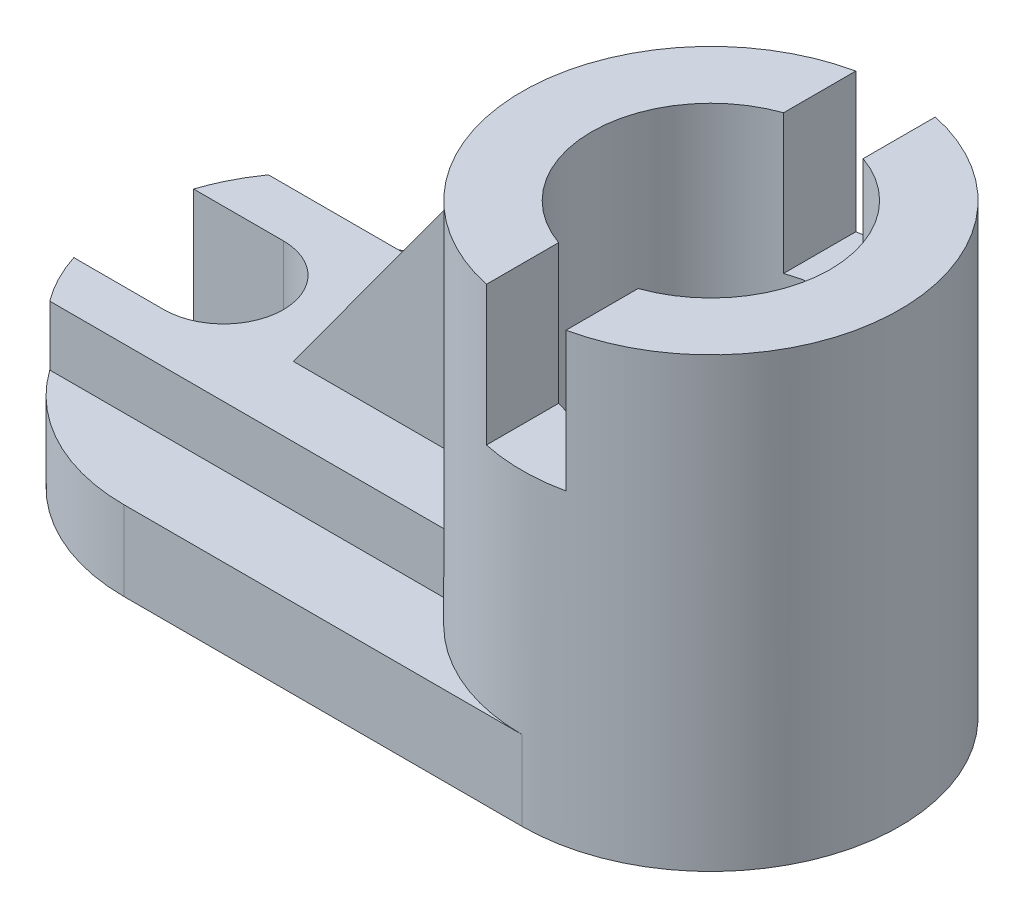
ISO-10303-21;
HEADER;
FILE_DESCRIPTION(('STEP AP214'),'2;1');
FILE_NAME('part.step','',(''),(''),'','','');
FILE_SCHEMA(('AUTOMOTIVE_DESIGN { 1 0 10303 214 1 1 1 1 }'));
ENDSEC;
DATA;
#1=APPLICATION_CONTEXT('core data for automotive mechanical design processes');
#2=APPLICATION_PROTOCOL_DEFINITION('international standard','automotive_design',2000,#1);
#3=PRODUCT_CONTEXT('',#1,'mechanical');
#4=PRODUCT('Part','Part','',(#3));
#5=PRODUCT_RELATED_PRODUCT_CATEGORY('part','',(#4));
#6=PRODUCT_DEFINITION_FORMATION('','',#4);
#7=PRODUCT_DEFINITION_CONTEXT('part definition',#1,'design');
#8=PRODUCT_DEFINITION('design','',#6,#7);
#9=PRODUCT_DEFINITION_SHAPE('','',#8);
#10=(LENGTH_UNIT() NAMED_UNIT(*) SI_UNIT(.MILLI.,.METRE.));
#11=(NAMED_UNIT(*) PLANE_ANGLE_UNIT() SI_UNIT($,.RADIAN.));
#12=(NAMED_UNIT(*) SI_UNIT($,.STERADIAN.) SOLID_ANGLE_UNIT());
#13=UNCERTAINTY_MEASURE_WITH_UNIT(LENGTH_MEASURE(1.E-05),#10,'distance_accuracy_value','');
#14=(GEOMETRIC_REPRESENTATION_CONTEXT(3) GLOBAL_UNCERTAINTY_ASSIGNED_CONTEXT((#13)) GLOBAL_UNIT_ASSIGNED_CONTEXT((#10,
#11,#12)) REPRESENTATION_CONTEXT('',''));
#15=CARTESIAN_POINT('',(0.,0.,0.));
#16=DIRECTION('',(0.,0.,1.));
#17=DIRECTION('',(1.,0.,0.));
#18=AXIS2_PLACEMENT_3D('',#15,#16,#17);
#19=CARTESIAN_POINT('',(0.,45.,0.));
#20=DIRECTION('',(0.,-1.,0.));
#21=DIRECTION('',(0.,0.,-1.));
#22=AXIS2_PLACEMENT_3D('',#19,#20,#21);
#23=CYLINDRICAL_SURFACE('',#22,19.);
#24=CARTESIAN_POINT('',(0.,0.,0.));
#25=DIRECTION('',(0.,1.,0.));
#26=DIRECTION('',(0.,0.,1.));
#27=AXIS2_PLACEMENT_3D('',#24,#25,#26);
#28=CIRCLE('',#27,19.);
#29=CARTESIAN_POINT('',(0.,0.,19.));
#30=VERTEX_POINT('',#29);
#31=CARTESIAN_POINT('',(0.,0.,-19.));
#32=VERTEX_POINT('',#31);
#33=EDGE_CURVE('E477',#30,#32,#28,.T.);
#34=ORIENTED_EDGE('',*,*,#33,.T.);
#35=DIRECTION('',(0.,-1.,0.));
#36=VECTOR('',#35,1.);
#37=CARTESIAN_POINT('',(0.,8.,-19.));
#38=LINE('',#37,#36);
#39=CARTESIAN_POINT('',(0.,8.,-19.));
#40=VERTEX_POINT('',#39);
#41=EDGE_CURVE('E531',#40,#32,#38,.T.);
#42=ORIENTED_EDGE('',*,*,#41,.F.);
#43=CARTESIAN_POINT('',(0.,8.,0.));
#44=DIRECTION('',(0.,1.,0.));
#45=DIRECTION('',(0.,0.,1.));
#46=AXIS2_PLACEMENT_3D('',#43,#44,#45);
#47=CIRCLE('',#46,19.);
#48=CARTESIAN_POINT('',(-15.4919333848297,8.,-11.));
#49=VERTEX_POINT('',#48);
#50=EDGE_CURVE('E436',#40,#49,#47,.T.);
#51=ORIENTED_EDGE('',*,*,#50,.T.);
#52=DIRECTION('',(0.,-1.,0.));
#53=VECTOR('',#52,1.);
#54=CARTESIAN_POINT('',(-15.4919333848297,45.,-11.));
#55=LINE('',#54,#53);
#56=CARTESIAN_POINT('',(-15.4919333848297,14.,-11.));
#57=VERTEX_POINT('',#56);
#58=EDGE_CURVE('E571',#57,#49,#55,.T.);
#59=ORIENTED_EDGE('',*,*,#58,.F.);
#60=CARTESIAN_POINT('',(0.,14.,0.));
#61=DIRECTION('',(0.,-1.,0.));
#62=DIRECTION('',(0.,0.,-1.));
#63=AXIS2_PLACEMENT_3D('',#60,#61,#62);
#64=CIRCLE('',#63,19.);
#65=CARTESIAN_POINT('',(-18.5741756210067,14.,-4.));
#66=VERTEX_POINT('',#65);
#67=EDGE_CURVE('E489',#66,#57,#64,.T.);
#68=ORIENTED_EDGE('',*,*,#67,.F.);
#69=DIRECTION('',(0.,-1.,0.));
#70=VECTOR('',#69,1.);
#71=CARTESIAN_POINT('',(-18.5741756210067,45.,-4.));
#72=LINE('',#71,#70);
#73=CARTESIAN_POINT('',(-18.5741756210067,40.5827070449382,-4.));
#74=VERTEX_POINT('',#73);
#75=EDGE_CURVE('E284',#74,#66,#72,.T.);
#76=ORIENTED_EDGE('',*,*,#75,.F.);
#77=CARTESIAN_POINT('',(0.,66.,0.));
#78=DIRECTION('',(-0.807391122257898,0.59001658934231,0.));
#79=DIRECTION('',(-0.59001658934231,-0.807391122257898,0.));
#80=AXIS2_PLACEMENT_3D('',#77,#78,#79);
#81=ELLIPSE('',#80,32.2024843762092,19.);
#82=CARTESIAN_POINT('',(-18.5741756210067,40.5827070449382,4.));
#83=VERTEX_POINT('',#82);
#84=EDGE_CURVE('E297',#74,#83,#81,.T.);
#85=ORIENTED_EDGE('',*,*,#84,.T.);
#86=DIRECTION('',(0.,-1.,0.));
#87=VECTOR('',#86,1.);
#88=CARTESIAN_POINT('',(-18.5741756210067,45.,4.));
#89=LINE('',#88,#87);
#90=CARTESIAN_POINT('',(-18.5741756210067,14.,4.));
#91=VERTEX_POINT('',#90);
#92=EDGE_CURVE('E291',#83,#91,#89,.T.);
#93=ORIENTED_EDGE('',*,*,#92,.T.);
#94=CARTESIAN_POINT('',(-15.4919333848297,14.,11.));
#95=VERTEX_POINT('',#94);
#96=EDGE_CURVE('E431',#95,#91,#64,.T.);
#97=ORIENTED_EDGE('',*,*,#96,.F.);
#98=DIRECTION('',(0.,-1.,0.));
#99=VECTOR('',#98,1.);
#100=CARTESIAN_POINT('',(-15.4919333848297,45.,11.));
#101=LINE('',#100,#99);
#102=CARTESIAN_POINT('',(-15.4919333848297,8.,11.));
#103=VERTEX_POINT('',#102);
#104=EDGE_CURVE('E574',#103,#95,#101,.F.);
#105=ORIENTED_EDGE('',*,*,#104,.F.);
#106=CARTESIAN_POINT('',(0.,8.,19.));
#107=VERTEX_POINT('',#106);
#108=EDGE_CURVE('E470',#103,#107,#47,.T.);
#109=ORIENTED_EDGE('',*,*,#108,.T.);
#110=DIRECTION('',(0.,-1.,0.));
#111=VECTOR('',#110,1.);
#112=CARTESIAN_POINT('',(0.,8.,19.));
#113=LINE('',#112,#111);
#114=EDGE_CURVE('E534',#107,#30,#113,.T.);
#115=ORIENTED_EDGE('',*,*,#114,.T.);
#116=EDGE_LOOP('',(#34,#42,#51,#59,#68,#76,#85,#93,#97,#105,#109,#115));
#117=FACE_BOUND('',#116,.T.);
#118=CARTESIAN_POINT('',(0.,45.,0.));
#119=DIRECTION('',(0.,1.,0.));
#120=DIRECTION('',(0.,0.,1.));
#121=AXIS2_PLACEMENT_3D('',#118,#119,#120);
#122=CIRCLE('',#121,19.);
#123=CARTESIAN_POINT('',(4.,45.,18.5741756210067));
#124=VERTEX_POINT('',#123);
#125=CARTESIAN_POINT('',(4.,45.,-18.5741756210067));
#126=VERTEX_POINT('',#125);
#127=EDGE_CURVE('E467',#124,#126,#122,.T.);
#128=ORIENTED_EDGE('',*,*,#127,.F.);
#129=DIRECTION('',(0.,-1.,0.));
#130=VECTOR('',#129,1.);
#131=CARTESIAN_POINT('',(4.,45.,18.5741756210067));
#132=LINE('',#131,#130);
#133=CARTESIAN_POINT('',(4.,31.,18.5741756210067));
#134=VERTEX_POINT('',#133);
#135=EDGE_CURVE('E249',#124,#134,#132,.T.);
#136=ORIENTED_EDGE('',*,*,#135,.T.);
#137=CARTESIAN_POINT('',(0.,31.,0.));
#138=DIRECTION('',(0.,-1.,0.));
#139=DIRECTION('',(0.,0.,-1.));
#140=AXIS2_PLACEMENT_3D('',#137,#138,#139);
#141=CIRCLE('',#140,19.);
#142=CARTESIAN_POINT('',(-4.,31.,18.5741756210067));
#143=VERTEX_POINT('',#142);
#144=EDGE_CURVE('E241',#134,#143,#141,.T.);
#145=ORIENTED_EDGE('',*,*,#144,.T.);
#146=DIRECTION('',(0.,-1.,0.));
#147=VECTOR('',#146,1.);
#148=CARTESIAN_POINT('',(-4.,45.,18.5741756210067));
#149=LINE('',#148,#147);
#150=CARTESIAN_POINT('',(-4.,45.,18.5741756210067));
#151=VERTEX_POINT('',#150);
#152=EDGE_CURVE('E256',#151,#143,#149,.T.);
#153=ORIENTED_EDGE('',*,*,#152,.F.);
#154=CARTESIAN_POINT('',(-4.,45.,-18.5741756210067));
#155=VERTEX_POINT('',#154);
#156=EDGE_CURVE('E471',#155,#151,#122,.T.);
#157=ORIENTED_EDGE('',*,*,#156,.F.);
#158=DIRECTION('',(0.,-1.,0.));
#159=VECTOR('',#158,1.);
#160=CARTESIAN_POINT('',(-4.,45.,-18.5741756210067));
#161=LINE('',#160,#159);
#162=CARTESIAN_POINT('',(-4.,31.,-18.5741756210067));
#163=VERTEX_POINT('',#162);
#164=EDGE_CURVE('E239',#163,#155,#161,.F.);
#165=ORIENTED_EDGE('',*,*,#164,.F.);
#166=CARTESIAN_POINT('',(4.,31.,-18.5741756210067));
#167=VERTEX_POINT('',#166);
#168=EDGE_CURVE('E232',#163,#167,#141,.T.);
#169=ORIENTED_EDGE('',*,*,#168,.T.);
#170=DIRECTION('',(0.,-1.,0.));
#171=VECTOR('',#170,1.);
#172=CARTESIAN_POINT('',(4.,45.,-18.5741756210067));
#173=LINE('',#172,#171);
#174=EDGE_CURVE('E217',#167,#126,#173,.F.);
#175=ORIENTED_EDGE('',*,*,#174,.T.);
#176=EDGE_LOOP('',(#128,#136,#145,#153,#157,#165,#169,#175));
#177=FACE_BOUND('',#176,.T.);
#178=ADVANCED_FACE('F39',(#117,#177),#23,.T.);
#179=CARTESIAN_POINT('',(0.,45.,0.));
#180=DIRECTION('',(0.,1.,0.));
#181=DIRECTION('',(0.,0.,1.));
#182=AXIS2_PLACEMENT_3D('',#179,#180,#181);
#183=PLANE('',#182);
#184=ORIENTED_EDGE('',*,*,#156,.T.);
#185=DIRECTION('',(0.,0.,-1.));
#186=VECTOR('',#185,1.);
#187=CARTESIAN_POINT('',(-4.,45.,0.));
#188=LINE('',#187,#186);
#189=CARTESIAN_POINT('',(-4.,45.,11.3137084989848));
#190=VERTEX_POINT('',#189);
#191=EDGE_CURVE('E229',#151,#190,#188,.T.);
#192=ORIENTED_EDGE('',*,*,#191,.T.);
#193=CARTESIAN_POINT('',(0.,45.,0.));
#194=DIRECTION('',(0.,1.,0.));
#195=DIRECTION('',(0.,0.,1.));
#196=AXIS2_PLACEMENT_3D('',#193,#194,#195);
#197=CIRCLE('',#196,12.);
#198=CARTESIAN_POINT('',(-4.,45.,-11.3137084989848));
#199=VERTEX_POINT('',#198);
#200=EDGE_CURVE('E263',#199,#190,#197,.T.);
#201=ORIENTED_EDGE('',*,*,#200,.F.);
#202=EDGE_CURVE('E257',#199,#155,#188,.T.);
#203=ORIENTED_EDGE('',*,*,#202,.T.);
#204=EDGE_LOOP('',(#184,#192,#201,#203));
#205=FACE_BOUND('',#204,.T.);
#206=ADVANCED_FACE('F517',(#205),#183,.T.);
#207=CARTESIAN_POINT('',(0.,0.,0.));
#208=DIRECTION('',(0.,1.,0.));
#209=DIRECTION('',(0.,0.,1.));
#210=AXIS2_PLACEMENT_3D('',#207,#208,#209);
#211=CYLINDRICAL_SURFACE('',#210,12.);
#212=CARTESIAN_POINT('',(0.,0.,0.));
#213=DIRECTION('',(0.,1.,0.));
#214=DIRECTION('',(0.,0.,1.));
#215=AXIS2_PLACEMENT_3D('',#212,#213,#214);
#216=CIRCLE('',#215,12.);
#217=CARTESIAN_POINT('',(0.,0.,12.));
#218=VERTEX_POINT('',#217);
#219=EDGE_CURVE('E264',#218,#218,#216,.T.);
#220=ORIENTED_EDGE('',*,*,#219,.F.);
#221=EDGE_LOOP('',(#220));
#222=FACE_BOUND('',#221,.T.);
#223=DIRECTION('',(0.,1.,0.));
#224=VECTOR('',#223,1.);
#225=CARTESIAN_POINT('',(-4.,0.,11.3137084989848));
#226=LINE('',#225,#224);
#227=CARTESIAN_POINT('',(-4.,31.,11.3137084989848));
#228=VERTEX_POINT('',#227);
#229=EDGE_CURVE('E11',#228,#190,#226,.T.);
#230=ORIENTED_EDGE('',*,*,#229,.F.);
#231=CARTESIAN_POINT('',(0.,31.,0.));
#232=DIRECTION('',(0.,-1.,0.));
#233=DIRECTION('',(0.,0.,-1.));
#234=AXIS2_PLACEMENT_3D('',#231,#232,#233);
#235=CIRCLE('',#234,12.);
#236=CARTESIAN_POINT('',(4.,31.,11.3137084989848));
#237=VERTEX_POINT('',#236);
#238=EDGE_CURVE('E440',#228,#237,#235,.F.);
#239=ORIENTED_EDGE('',*,*,#238,.T.);
#240=DIRECTION('',(0.,1.,0.));
#241=VECTOR('',#240,1.);
#242=CARTESIAN_POINT('',(4.,0.,11.3137084989848));
#243=LINE('',#242,#241);
#244=CARTESIAN_POINT('',(4.,45.,11.3137084989848));
#245=VERTEX_POINT('',#244);
#246=EDGE_CURVE('E47',#237,#245,#243,.T.);
#247=ORIENTED_EDGE('',*,*,#246,.T.);
#248=CARTESIAN_POINT('',(4.,45.,-11.3137084989848));
#249=VERTEX_POINT('',#248);
#250=EDGE_CURVE('E269',#245,#249,#197,.T.);
#251=ORIENTED_EDGE('',*,*,#250,.T.);
#252=DIRECTION('',(0.,1.,0.));
#253=VECTOR('',#252,1.);
#254=CARTESIAN_POINT('',(4.,0.,-11.3137084989848));
#255=LINE('',#254,#253);
#256=CARTESIAN_POINT('',(4.,31.,-11.3137084989848));
#257=VERTEX_POINT('',#256);
#258=EDGE_CURVE('E439',#249,#257,#255,.F.);
#259=ORIENTED_EDGE('',*,*,#258,.T.);
#260=CARTESIAN_POINT('',(-4.,31.,-11.3137084989848));
#261=VERTEX_POINT('',#260);
#262=EDGE_CURVE('E234',#257,#261,#235,.F.);
#263=ORIENTED_EDGE('',*,*,#262,.T.);
#264=DIRECTION('',(0.,1.,0.));
#265=VECTOR('',#264,1.);
#266=CARTESIAN_POINT('',(-4.,0.,-11.3137084989848));
#267=LINE('',#266,#265);
#268=EDGE_CURVE('E443',#199,#261,#267,.F.);
#269=ORIENTED_EDGE('',*,*,#268,.F.);
#270=ORIENTED_EDGE('',*,*,#200,.T.);
#271=EDGE_LOOP('',(#230,#239,#247,#251,#259,#263,#269,#270));
#272=FACE_BOUND('',#271,.T.);
#273=ADVANCED_FACE('F452',(#222,#272),#211,.F.);
#274=CARTESIAN_POINT('',(-40.,8.,0.));
#275=DIRECTION('',(0.,-1.,0.));
#276=DIRECTION('',(0.,0.,-1.));
#277=AXIS2_PLACEMENT_3D('',#274,#275,#276);
#278=CYLINDRICAL_SURFACE('',#277,19.);
#279=CARTESIAN_POINT('',(-40.,8.,0.));
#280=DIRECTION('',(0.,1.,0.));
#281=DIRECTION('',(0.,0.,1.));
#282=AXIS2_PLACEMENT_3D('',#279,#280,#281);
#283=CIRCLE('',#282,19.);
#284=CARTESIAN_POINT('',(-58.0304879395037,8.,5.99178643339468));
#285=VERTEX_POINT('',#284);
#286=CARTESIAN_POINT('',(-55.4919333848297,8.,11.));
#287=VERTEX_POINT('',#286);
#288=EDGE_CURVE('E409',#285,#287,#283,.T.);
#289=ORIENTED_EDGE('',*,*,#288,.F.);
#290=DIRECTION('',(0.,-1.,0.));
#291=VECTOR('',#290,1.);
#292=CARTESIAN_POINT('',(-58.0304879395037,8.,5.99178643339468));
#293=LINE('',#292,#291);
#294=CARTESIAN_POINT('',(-58.0304879395037,0.,5.99178643339469));
#295=VERTEX_POINT('',#294);
#296=EDGE_CURVE('E358',#285,#295,#293,.T.);
#297=ORIENTED_EDGE('',*,*,#296,.T.);
#298=CARTESIAN_POINT('',(-40.,0.,0.));
#299=DIRECTION('',(0.,1.,0.));
#300=DIRECTION('',(0.,0.,1.));
#301=AXIS2_PLACEMENT_3D('',#298,#299,#300);
#302=CIRCLE('',#301,19.);
#303=CARTESIAN_POINT('',(-40.,0.,19.));
#304=VERTEX_POINT('',#303);
#305=EDGE_CURVE('E569',#295,#304,#302,.T.);
#306=ORIENTED_EDGE('',*,*,#305,.T.);
#307=DIRECTION('',(0.,-1.,0.));
#308=VECTOR('',#307,1.);
#309=CARTESIAN_POINT('',(-40.,8.,19.));
#310=LINE('',#309,#308);
#311=CARTESIAN_POINT('',(-40.,8.,19.));
#312=VERTEX_POINT('',#311);
#313=EDGE_CURVE('E480',#312,#304,#310,.T.);
#314=ORIENTED_EDGE('',*,*,#313,.F.);
#315=EDGE_CURVE('E400',#287,#312,#283,.T.);
#316=ORIENTED_EDGE('',*,*,#315,.F.);
#317=EDGE_LOOP('',(#289,#297,#306,#314,#316));
#318=FACE_BOUND('',#317,.T.);
#319=ADVANCED_FACE('F512',(#318),#278,.T.);
#320=CARTESIAN_POINT('',(-55.4919333848297,14.,-11.));
#321=CARTESIAN_POINT('',(-60.0193993225468,14.,-4.70615989860485));
#322=CARTESIAN_POINT('',(-60.3179924039532,14.,4.54061158290516));
#323=CARTESIAN_POINT('',(-55.4919333848297,14.,11.));
#324=B_SPLINE_CURVE_WITH_KNOTS('',3,(#320,#321,#322,#323),.UNSPECIFIED.,.F.,.F.,(4,4),(0.,1.),.UNSPECIFIED.);
#325=DIRECTION('',(0.,-1.,0.));
#326=VECTOR('',#325,1.);
#327=SURFACE_OF_LINEAR_EXTRUSION('',#324,#326);
#328=CARTESIAN_POINT('',(-58.0978244236341,14.,5.93368382028486));
#329=VERTEX_POINT('',#328);
#330=CARTESIAN_POINT('',(-55.4919333848297,14.,11.));
#331=VERTEX_POINT('',#330);
#332=EDGE_CURVE('E366',#329,#331,#324,.T.);
#333=ORIENTED_EDGE('',*,*,#332,.F.);
#334=DIRECTION('',(0.,-1.,0.));
#335=VECTOR('',#334,1.);
#336=CARTESIAN_POINT('',(-58.0978244306814,14.,5.93368381420402));
#337=LINE('',#336,#335);
#338=CARTESIAN_POINT('',(-58.0978244306814,8.,5.93368381420402));
#339=VERTEX_POINT('',#338);
#340=EDGE_CURVE('E351',#329,#339,#337,.T.);
#341=ORIENTED_EDGE('',*,*,#340,.T.);
#342=CARTESIAN_POINT('',(-55.4919333848297,8.,-11.));
#343=CARTESIAN_POINT('',(-60.0193993225468,8.,-4.70615989860485));
#344=CARTESIAN_POINT('',(-60.3179924039532,8.,4.54061158290516));
#345=CARTESIAN_POINT('',(-55.4919333848297,8.,11.));
#346=B_SPLINE_CURVE_WITH_KNOTS('',3,(#342,#343,#344,#345),.UNSPECIFIED.,.F.,.F.,(4,4),(0.,1.),.UNSPECIFIED.);
#347=EDGE_CURVE('E362',#339,#287,#346,.T.);
#348=ORIENTED_EDGE('',*,*,#347,.T.);
#349=DIRECTION('',(0.,-1.,0.));
#350=VECTOR('',#349,1.);
#351=CARTESIAN_POINT('',(-55.4919333848297,14.,11.));
#352=LINE('',#351,#350);
#353=EDGE_CURVE('E668',#331,#287,#352,.T.);
#354=ORIENTED_EDGE('',*,*,#353,.F.);
#355=EDGE_LOOP('',(#333,#341,#348,#354));
#356=FACE_BOUND('',#355,.T.);
#357=ADVANCED_FACE('F389',(#356),#327,.F.);
#358=CARTESIAN_POINT('',(-40.,8.,0.));
#359=DIRECTION('',(0.,1.,0.));
#360=DIRECTION('',(0.,0.,1.));
#361=AXIS2_PLACEMENT_3D('',#358,#359,#360);
#362=PLANE('',#361);
#363=CARTESIAN_POINT('',(-40.,8.,-19.));
#364=VERTEX_POINT('',#363);
#365=CARTESIAN_POINT('',(-55.4919333848297,8.,-11.));
#366=VERTEX_POINT('',#365);
#367=EDGE_CURVE('E415',#364,#366,#283,.T.);
#368=ORIENTED_EDGE('',*,*,#367,.T.);
#369=DIRECTION('',(1.,0.,0.));
#370=VECTOR('',#369,1.);
#371=CARTESIAN_POINT('',(-40.,8.,-11.));
#372=LINE('',#371,#370);
#373=EDGE_CURVE('E435',#366,#49,#372,.T.);
#374=ORIENTED_EDGE('',*,*,#373,.T.);
#375=ORIENTED_EDGE('',*,*,#50,.F.);
#376=DIRECTION('',(-1.,0.,0.));
#377=VECTOR('',#376,1.);
#378=CARTESIAN_POINT('',(-40.,8.,-19.));
#379=LINE('',#378,#377);
#380=EDGE_CURVE('E543',#40,#364,#379,.T.);
#381=ORIENTED_EDGE('',*,*,#380,.T.);
#382=EDGE_LOOP('',(#368,#374,#375,#381));
#383=FACE_BOUND('',#382,.T.);
#384=ADVANCED_FACE('F702',(#383),#362,.T.);
#385=DIRECTION('',(-0.835222152473032,0.,0.549912680357814));
#386=VECTOR('',#385,1.);
#387=CARTESIAN_POINT('',(-48.2054078455799,8.,-12.4625938762588));
#388=LINE('',#387,#386);
#389=CARTESIAN_POINT('',(-58.0209690441012,8.,-5.99999999999153));
#390=VERTEX_POINT('',#389);
#391=CARTESIAN_POINT('',(-58.0296597638088,8.,-5.99427800500551));
#392=VERTEX_POINT('',#391);
#393=EDGE_CURVE('E348',#390,#392,#388,.T.);
#394=ORIENTED_EDGE('',*,*,#393,.F.);
#395=CARTESIAN_POINT('',(-55.4919333848297,8.,-11.));
#396=CARTESIAN_POINT('',(-60.0193993225468,8.,-4.70615989860485));
#397=CARTESIAN_POINT('',(-60.3179924039532,8.,4.54061158290516));
#398=CARTESIAN_POINT('',(-55.4919333848297,8.,11.));
#399=B_SPLINE_CURVE_WITH_KNOTS('',3,(#395,#396,#397,#398),.UNSPECIFIED.,.F.,.F.,(4,4),(0.,1.),.UNSPECIFIED.);
#400=CARTESIAN_POINT('',(-57.401020368827,8.,-7.62918672753978));
#401=VERTEX_POINT('',#400);
#402=EDGE_CURVE('E432',#390,#401,#399,.F.);
#403=ORIENTED_EDGE('',*,*,#402,.T.);
#404=EDGE_CURVE('E419',#401,#392,#283,.T.);
#405=ORIENTED_EDGE('',*,*,#404,.T.);
#406=EDGE_LOOP('',(#394,#403,#405));
#407=FACE_BOUND('',#406,.T.);
#408=ADVANCED_FACE('F592',(#407),#362,.T.);
#409=ORIENTED_EDGE('',*,*,#108,.F.);
#410=DIRECTION('',(1.,0.,0.));
#411=VECTOR('',#410,1.);
#412=CARTESIAN_POINT('',(-9.99999999999999,8.,11.));
#413=LINE('',#412,#411);
#414=EDGE_CURVE('E367',#287,#103,#413,.T.);
#415=ORIENTED_EDGE('',*,*,#414,.F.);
#416=ORIENTED_EDGE('',*,*,#315,.T.);
#417=DIRECTION('',(1.,0.,0.));
#418=VECTOR('',#417,1.);
#419=CARTESIAN_POINT('',(-40.,8.,19.));
#420=LINE('',#419,#418);
#421=EDGE_CURVE('E411',#312,#107,#420,.T.);
#422=ORIENTED_EDGE('',*,*,#421,.T.);
#423=EDGE_LOOP('',(#409,#415,#416,#422));
#424=FACE_BOUND('',#423,.T.);
#425=ADVANCED_FACE('F516',(#424),#362,.T.);
#426=DIRECTION('',(0.,0.,-1.));
#427=VECTOR('',#426,1.);
#428=CARTESIAN_POINT('',(4.,45.,0.));
#429=LINE('',#428,#427);
#430=EDGE_CURVE('E244',#124,#245,#429,.T.);
#431=ORIENTED_EDGE('',*,*,#430,.F.);
#432=ORIENTED_EDGE('',*,*,#127,.T.);
#433=EDGE_CURVE('E223',#249,#126,#429,.T.);
#434=ORIENTED_EDGE('',*,*,#433,.F.);
#435=ORIENTED_EDGE('',*,*,#250,.F.);
#436=EDGE_LOOP('',(#431,#432,#434,#435));
#437=FACE_BOUND('',#436,.T.);
#438=ADVANCED_FACE('F514',(#437),#183,.T.);
#439=CARTESIAN_POINT('',(0.,0.,0.));
#440=DIRECTION('',(0.,1.,0.));
#441=DIRECTION('',(0.,0.,1.));
#442=AXIS2_PLACEMENT_3D('',#439,#440,#441);
#443=PLANE('',#442);
#444=ORIENTED_EDGE('',*,*,#219,.T.);
#445=EDGE_LOOP('',(#444));
#446=FACE_BOUND('',#445,.T.);
#447=CARTESIAN_POINT('',(-48.9999999999742,0.,0.));
#448=DIRECTION('',(0.,1.,0.));
#449=DIRECTION('',(0.,0.,1.));
#450=AXIS2_PLACEMENT_3D('',#447,#448,#449);
#451=CIRCLE('',#450,5.99999999999153);
#452=CARTESIAN_POINT('',(-48.9999999999742,0.,5.99999999999153));
#453=VERTEX_POINT('',#452);
#454=CARTESIAN_POINT('',(-48.9999999999742,0.,-5.99999999999153));
#455=VERTEX_POINT('',#454);
#456=EDGE_CURVE('E310',#453,#455,#451,.T.);
#457=ORIENTED_EDGE('',*,*,#456,.T.);
#458=DIRECTION('',(-1.,0.,0.));
#459=VECTOR('',#458,1.);
#460=CARTESIAN_POINT('',(-48.9999999999742,0.,-5.99999999999153));
#461=LINE('',#460,#459);
#462=CARTESIAN_POINT('',(-58.0209690441012,0.,-5.99999999999153));
#463=VERTEX_POINT('',#462);
#464=EDGE_CURVE('E313',#455,#463,#461,.T.);
#465=ORIENTED_EDGE('',*,*,#464,.T.);
#466=DIRECTION('',(-0.835222152473032,0.,0.549912680357814));
#467=VECTOR('',#466,1.);
#468=CARTESIAN_POINT('',(-58.0209690441012,0.,-5.99999999999153));
#469=LINE('',#468,#467);
#470=CARTESIAN_POINT('',(-58.0296597638088,0.,-5.9942780050055));
#471=VERTEX_POINT('',#470);
#472=EDGE_CURVE('E317',#463,#471,#469,.T.);
#473=ORIENTED_EDGE('',*,*,#472,.T.);
#474=CARTESIAN_POINT('',(-40.,0.,-19.));
#475=VERTEX_POINT('',#474);
#476=EDGE_CURVE('E549',#475,#471,#302,.T.);
#477=ORIENTED_EDGE('',*,*,#476,.F.);
#478=DIRECTION('',(-1.,0.,0.));
#479=VECTOR('',#478,1.);
#480=CARTESIAN_POINT('',(-40.,0.,-19.));
#481=LINE('',#480,#479);
#482=EDGE_CURVE('E410',#32,#475,#481,.T.);
#483=ORIENTED_EDGE('',*,*,#482,.F.);
#484=ORIENTED_EDGE('',*,*,#33,.F.);
#485=DIRECTION('',(1.,0.,0.));
#486=VECTOR('',#485,1.);
#487=CARTESIAN_POINT('',(-40.,0.,19.));
#488=LINE('',#487,#486);
#489=EDGE_CURVE('E551',#304,#30,#488,.T.);
#490=ORIENTED_EDGE('',*,*,#489,.F.);
#491=ORIENTED_EDGE('',*,*,#305,.F.);
#492=DIRECTION('',(0.757110061027638,0.,0.653287345270615));
#493=VECTOR('',#492,1.);
#494=CARTESIAN_POINT('',(-65.9091015980735,0.,-0.806430716743023));
#495=LINE('',#494,#493);
#496=CARTESIAN_POINT('',(-58.0209690441012,0.,5.99999999999153));
#497=VERTEX_POINT('',#496);
#498=EDGE_CURVE('E301',#295,#497,#495,.T.);
#499=ORIENTED_EDGE('',*,*,#498,.T.);
#500=DIRECTION('',(1.,0.,0.));
#501=VECTOR('',#500,1.);
#502=CARTESIAN_POINT('',(-48.9999999999742,0.,5.99999999999153));
#503=LINE('',#502,#501);
#504=EDGE_CURVE('E305',#497,#453,#503,.T.);
#505=ORIENTED_EDGE('',*,*,#504,.T.);
#506=EDGE_LOOP('',(#457,#465,#473,#477,#483,#484,#490,#491,#499,#505));
#507=FACE_BOUND('',#506,.T.);
#508=ADVANCED_FACE('F511',(#446,#507),#443,.F.);
#509=ORIENTED_EDGE('',*,*,#476,.T.);
#510=DIRECTION('',(0.,-1.,0.));
#511=VECTOR('',#510,1.);
#512=CARTESIAN_POINT('',(-58.0296597638088,8.,-5.99427800500551));
#513=LINE('',#512,#511);
#514=EDGE_CURVE('E335',#471,#392,#513,.F.);
#515=ORIENTED_EDGE('',*,*,#514,.T.);
#516=ORIENTED_EDGE('',*,*,#404,.F.);
#517=CARTESIAN_POINT('',(-55.4919333848297,8.,-11.));
#518=CARTESIAN_POINT('',(-56.2474419031513,8.,-9.94973261533675));
#519=CARTESIAN_POINT('',(-56.8851917288185,8.,-8.81723685667508));
#520=CARTESIAN_POINT('',(-57.401020368827,8.,-7.62918672753978));
#521=B_SPLINE_CURVE_WITH_KNOTS('',3,(#517,#518,#519,#520),.UNSPECIFIED.,.F.,.F.,(4,4),(0.,
0.166872269988308),.UNSPECIFIED.);
#522=EDGE_CURVE('E423',#366,#401,#521,.T.);
#523=ORIENTED_EDGE('',*,*,#522,.F.);
#524=ORIENTED_EDGE('',*,*,#367,.F.);
#525=DIRECTION('',(0.,-1.,0.));
#526=VECTOR('',#525,1.);
#527=CARTESIAN_POINT('',(-40.,8.,-19.));
#528=LINE('',#527,#526);
#529=EDGE_CURVE('E545',#364,#475,#528,.T.);
#530=ORIENTED_EDGE('',*,*,#529,.T.);
#531=EDGE_LOOP('',(#509,#515,#516,#523,#524,#530));
#532=FACE_BOUND('',#531,.T.);
#533=ADVANCED_FACE('F500',(#532),#278,.T.);
#534=CARTESIAN_POINT('',(-40.,8.,19.));
#535=DIRECTION('',(0.,0.,-1.));
#536=DIRECTION('',(-1.,0.,0.));
#537=AXIS2_PLACEMENT_3D('',#534,#535,#536);
#538=PLANE('',#537);
#539=ORIENTED_EDGE('',*,*,#489,.T.);
#540=ORIENTED_EDGE('',*,*,#114,.F.);
#541=ORIENTED_EDGE('',*,*,#421,.F.);
#542=ORIENTED_EDGE('',*,*,#313,.T.);
#543=EDGE_LOOP('',(#539,#540,#541,#542));
#544=FACE_BOUND('',#543,.T.);
#545=ADVANCED_FACE('F510',(#544),#538,.F.);
#546=CARTESIAN_POINT('',(-40.,8.,-19.));
#547=DIRECTION('',(0.,0.,1.));
#548=DIRECTION('',(1.,0.,0.));
#549=AXIS2_PLACEMENT_3D('',#546,#547,#548);
#550=PLANE('',#549);
#551=ORIENTED_EDGE('',*,*,#482,.T.);
#552=ORIENTED_EDGE('',*,*,#529,.F.);
#553=ORIENTED_EDGE('',*,*,#380,.F.);
#554=ORIENTED_EDGE('',*,*,#41,.T.);
#555=EDGE_LOOP('',(#551,#552,#553,#554));
#556=FACE_BOUND('',#555,.T.);
#557=ADVANCED_FACE('F540',(#556),#550,.F.);
#558=CARTESIAN_POINT('',(-58.9995052436449,8.,-0.0620806183873849));
#559=DIRECTION('',(0.,-1.,0.));
#560=DIRECTION('',(0.,0.,-1.));
#561=AXIS2_PLACEMENT_3D('',#558,#559,#560);
#562=PLANE('',#561);
#563=DIRECTION('',(-0.757110061027637,0.,-0.653287345270614));
#564=VECTOR('',#563,1.);
#565=CARTESIAN_POINT('',(-61.5802495543217,8.,2.92880462789554));
#566=LINE('',#565,#564);
#567=EDGE_CURVE('E355',#285,#339,#566,.T.);
#568=ORIENTED_EDGE('',*,*,#567,.F.);
#569=ORIENTED_EDGE('',*,*,#288,.T.);
#570=ORIENTED_EDGE('',*,*,#347,.F.);
#571=EDGE_LOOP('',(#568,#569,#570));
#572=FACE_BOUND('',#571,.T.);
#573=ADVANCED_FACE('F651',(#572),#562,.T.);
#574=CARTESIAN_POINT('',(-9.99999999999999,14.,-11.));
#575=DIRECTION('',(0.,0.,1.));
#576=DIRECTION('',(1.,0.,0.));
#577=AXIS2_PLACEMENT_3D('',#574,#575,#576);
#578=PLANE('',#577);
#579=DIRECTION('',(-1.,0.,0.));
#580=VECTOR('',#579,1.);
#581=CARTESIAN_POINT('',(-9.99999999999999,14.,-11.));
#582=LINE('',#581,#580);
#583=CARTESIAN_POINT('',(-55.4919333848297,14.,-11.));
#584=VERTEX_POINT('',#583);
#585=EDGE_CURVE('E363',#57,#584,#582,.T.);
#586=ORIENTED_EDGE('',*,*,#585,.F.);
#587=ORIENTED_EDGE('',*,*,#58,.T.);
#588=ORIENTED_EDGE('',*,*,#373,.F.);
#589=DIRECTION('',(0.,-1.,0.));
#590=VECTOR('',#589,1.);
#591=CARTESIAN_POINT('',(-55.4919333848297,14.,-11.));
#592=LINE('',#591,#590);
#593=EDGE_CURVE('E589',#584,#366,#592,.T.);
#594=ORIENTED_EDGE('',*,*,#593,.F.);
#595=EDGE_LOOP('',(#586,#587,#588,#594));
#596=FACE_BOUND('',#595,.T.);
#597=ADVANCED_FACE('F391',(#596),#578,.F.);
#598=CARTESIAN_POINT('',(-9.99999999999999,14.,11.));
#599=DIRECTION('',(0.,0.,-1.));
#600=DIRECTION('',(-1.,0.,0.));
#601=AXIS2_PLACEMENT_3D('',#598,#599,#600);
#602=PLANE('',#601);
#603=ORIENTED_EDGE('',*,*,#414,.T.);
#604=ORIENTED_EDGE('',*,*,#104,.T.);
#605=DIRECTION('',(1.,0.,0.));
#606=VECTOR('',#605,1.);
#607=CARTESIAN_POINT('',(-9.99999999999999,14.,11.));
#608=LINE('',#607,#606);
#609=EDGE_CURVE('E375',#331,#95,#608,.T.);
#610=ORIENTED_EDGE('',*,*,#609,.F.);
#611=ORIENTED_EDGE('',*,*,#353,.T.);
#612=EDGE_LOOP('',(#603,#604,#610,#611));
#613=FACE_BOUND('',#612,.T.);
#614=ADVANCED_FACE('F387',(#613),#602,.F.);
#615=ORIENTED_EDGE('',*,*,#402,.F.);
#616=DIRECTION('',(0.,1.,0.));
#617=VECTOR('',#616,1.);
#618=CARTESIAN_POINT('',(-58.0209690441012,0.,-5.99999999999153));
#619=LINE('',#618,#617);
#620=CARTESIAN_POINT('',(-58.0209690441012,14.,-5.99999999999153));
#621=VERTEX_POINT('',#620);
#622=EDGE_CURVE('E336',#390,#621,#619,.T.);
#623=ORIENTED_EDGE('',*,*,#622,.T.);
#624=EDGE_CURVE('E368',#584,#621,#324,.T.);
#625=ORIENTED_EDGE('',*,*,#624,.F.);
#626=ORIENTED_EDGE('',*,*,#593,.T.);
#627=ORIENTED_EDGE('',*,*,#522,.T.);
#628=EDGE_LOOP('',(#615,#623,#625,#626,#627));
#629=FACE_BOUND('',#628,.T.);
#630=ADVANCED_FACE('F381',(#629),#327,.F.);
#631=CARTESIAN_POINT('',(-58.9995052436449,14.,-0.0620806183873849));
#632=DIRECTION('',(0.,-1.,0.));
#633=DIRECTION('',(0.,0.,-1.));
#634=AXIS2_PLACEMENT_3D('',#631,#632,#633);
#635=PLANE('',#634);
#636=ORIENTED_EDGE('',*,*,#96,.T.);
#637=DIRECTION('',(-1.,0.,0.));
#638=VECTOR('',#637,1.);
#639=CARTESIAN_POINT('',(-58.9995052436449,14.,4.));
#640=LINE('',#639,#638);
#641=CARTESIAN_POINT('',(-38.,14.,4.));
#642=VERTEX_POINT('',#641);
#643=EDGE_CURVE('E288',#91,#642,#640,.T.);
#644=ORIENTED_EDGE('',*,*,#643,.T.);
#645=DIRECTION('',(0.,0.,-1.));
#646=VECTOR('',#645,1.);
#647=CARTESIAN_POINT('',(-38.,14.,-0.0620806183873849));
#648=LINE('',#647,#646);
#649=CARTESIAN_POINT('',(-38.,14.,-4.));
#650=VERTEX_POINT('',#649);
#651=EDGE_CURVE('E294',#642,#650,#648,.T.);
#652=ORIENTED_EDGE('',*,*,#651,.T.);
#653=DIRECTION('',(-1.,0.,0.));
#654=VECTOR('',#653,1.);
#655=CARTESIAN_POINT('',(-58.9995052436449,14.,-4.));
#656=LINE('',#655,#654);
#657=EDGE_CURVE('E277',#66,#650,#656,.T.);
#658=ORIENTED_EDGE('',*,*,#657,.F.);
#659=ORIENTED_EDGE('',*,*,#67,.T.);
#660=ORIENTED_EDGE('',*,*,#585,.T.);
#661=ORIENTED_EDGE('',*,*,#624,.T.);
#662=DIRECTION('',(-1.,0.,0.));
#663=VECTOR('',#662,1.);
#664=CARTESIAN_POINT('',(-48.9999999999742,14.,-5.99999999999153));
#665=LINE('',#664,#663);
#666=CARTESIAN_POINT('',(-48.9999999999742,14.,-5.99999999999153));
#667=VERTEX_POINT('',#666);
#668=EDGE_CURVE('E306',#667,#621,#665,.T.);
#669=ORIENTED_EDGE('',*,*,#668,.F.);
#670=CARTESIAN_POINT('',(-48.9999999999742,14.,0.));
#671=DIRECTION('',(0.,1.,0.));
#672=DIRECTION('',(0.,0.,1.));
#673=AXIS2_PLACEMENT_3D('',#670,#671,#672);
#674=CIRCLE('',#673,5.99999999999153);
#675=CARTESIAN_POINT('',(-48.9999999999742,14.,5.99999999999153));
#676=VERTEX_POINT('',#675);
#677=EDGE_CURVE('E325',#676,#667,#674,.T.);
#678=ORIENTED_EDGE('',*,*,#677,.F.);
#679=DIRECTION('',(1.,0.,0.));
#680=VECTOR('',#679,1.);
#681=CARTESIAN_POINT('',(-48.9999999999742,14.,5.99999999999153));
#682=LINE('',#681,#680);
#683=CARTESIAN_POINT('',(-58.0209690441012,14.,5.99999999999153));
#684=VERTEX_POINT('',#683);
#685=EDGE_CURVE('E300',#684,#676,#682,.T.);
#686=ORIENTED_EDGE('',*,*,#685,.F.);
#687=DIRECTION('',(-0.757110061027637,0.,-0.653287345270614));
#688=VECTOR('',#687,1.);
#689=CARTESIAN_POINT('',(-61.5802495543217,14.,2.92880462789554));
#690=LINE('',#689,#688);
#691=EDGE_CURVE('E427',#684,#329,#690,.T.);
#692=ORIENTED_EDGE('',*,*,#691,.T.);
#693=ORIENTED_EDGE('',*,*,#332,.T.);
#694=ORIENTED_EDGE('',*,*,#609,.T.);
#695=EDGE_LOOP('',(#636,#644,#652,#658,#659,#660,#661,#669,#678,#686,#692,#693,#694));
#696=FACE_BOUND('',#695,.T.);
#697=ADVANCED_FACE('F386',(#696),#635,.F.);
#698=CARTESIAN_POINT('',(-65.9091015980735,0.,-0.806430716743023));
#699=DIRECTION('',(-0.653287345270614,0.,0.757110061027637));
#700=DIRECTION('',(0.757110061027637,0.,0.653287345270614));
#701=AXIS2_PLACEMENT_3D('',#698,#699,#700);
#702=PLANE('',#701);
#703=ORIENTED_EDGE('',*,*,#567,.T.);
#704=ORIENTED_EDGE('',*,*,#340,.F.);
#705=ORIENTED_EDGE('',*,*,#691,.F.);
#706=DIRECTION('',(0.,1.,0.));
#707=VECTOR('',#706,1.);
#708=CARTESIAN_POINT('',(-58.0209690441012,0.,5.99999999999153));
#709=LINE('',#708,#707);
#710=EDGE_CURVE('E321',#497,#684,#709,.T.);
#711=ORIENTED_EDGE('',*,*,#710,.F.);
#712=ORIENTED_EDGE('',*,*,#498,.F.);
#713=ORIENTED_EDGE('',*,*,#296,.F.);
#714=EDGE_LOOP('',(#703,#704,#705,#711,#712,#713));
#715=FACE_BOUND('',#714,.T.);
#716=ADVANCED_FACE('F636',(#715),#702,.F.);
#717=CARTESIAN_POINT('',(-58.0209690441012,0.,-5.99999999999153));
#718=DIRECTION('',(-0.549912680357814,0.,-0.835222152473032));
#719=DIRECTION('',(-0.835222152473032,0.,0.549912680357814));
#720=AXIS2_PLACEMENT_3D('',#717,#718,#719);
#721=PLANE('',#720);
#722=ORIENTED_EDGE('',*,*,#393,.T.);
#723=ORIENTED_EDGE('',*,*,#514,.F.);
#724=ORIENTED_EDGE('',*,*,#472,.F.);
#725=EDGE_CURVE('E331',#463,#390,#619,.T.);
#726=ORIENTED_EDGE('',*,*,#725,.T.);
#727=EDGE_LOOP('',(#722,#723,#724,#726));
#728=FACE_BOUND('',#727,.T.);
#729=ADVANCED_FACE('F594',(#728),#721,.F.);
#730=CARTESIAN_POINT('',(-48.9999999999742,0.,-5.99999999999153));
#731=DIRECTION('',(0.,0.,-1.));
#732=DIRECTION('',(-1.,0.,0.));
#733=AXIS2_PLACEMENT_3D('',#730,#731,#732);
#734=PLANE('',#733);
#735=ORIENTED_EDGE('',*,*,#668,.T.);
#736=ORIENTED_EDGE('',*,*,#622,.F.);
#737=ORIENTED_EDGE('',*,*,#725,.F.);
#738=ORIENTED_EDGE('',*,*,#464,.F.);
#739=DIRECTION('',(0.,1.,0.));
#740=VECTOR('',#739,1.);
#741=CARTESIAN_POINT('',(-48.9999999999742,0.,-5.99999999999153));
#742=LINE('',#741,#740);
#743=EDGE_CURVE('E337',#455,#667,#742,.T.);
#744=ORIENTED_EDGE('',*,*,#743,.T.);
#745=EDGE_LOOP('',(#735,#736,#737,#738,#744));
#746=FACE_BOUND('',#745,.T.);
#747=ADVANCED_FACE('F598',(#746),#734,.F.);
#748=CARTESIAN_POINT('',(-48.9999999999742,0.,0.));
#749=DIRECTION('',(0.,1.,0.));
#750=DIRECTION('',(0.,0.,1.));
#751=AXIS2_PLACEMENT_3D('',#748,#749,#750);
#752=CYLINDRICAL_SURFACE('',#751,5.99999999999153);
#753=ORIENTED_EDGE('',*,*,#743,.F.);
#754=ORIENTED_EDGE('',*,*,#456,.F.);
#755=DIRECTION('',(0.,1.,0.));
#756=VECTOR('',#755,1.);
#757=CARTESIAN_POINT('',(-48.9999999999742,0.,5.99999999999153));
#758=LINE('',#757,#756);
#759=EDGE_CURVE('E340',#453,#676,#758,.T.);
#760=ORIENTED_EDGE('',*,*,#759,.T.);
#761=ORIENTED_EDGE('',*,*,#677,.T.);
#762=EDGE_LOOP('',(#753,#754,#760,#761));
#763=FACE_BOUND('',#762,.T.);
#764=ADVANCED_FACE('F639',(#763),#752,.F.);
#765=CARTESIAN_POINT('',(-48.9999999999742,0.,5.99999999999153));
#766=DIRECTION('',(0.,0.,1.));
#767=DIRECTION('',(1.,0.,0.));
#768=AXIS2_PLACEMENT_3D('',#765,#766,#767);
#769=PLANE('',#768);
#770=ORIENTED_EDGE('',*,*,#685,.T.);
#771=ORIENTED_EDGE('',*,*,#759,.F.);
#772=ORIENTED_EDGE('',*,*,#504,.F.);
#773=ORIENTED_EDGE('',*,*,#710,.T.);
#774=EDGE_LOOP('',(#770,#771,#772,#773));
#775=FACE_BOUND('',#774,.T.);
#776=ADVANCED_FACE('F632',(#775),#769,.F.);
#777=CARTESIAN_POINT('',(-19.,40.,0.));
#778=DIRECTION('',(-0.807391122257898,0.59001658934231,0.));
#779=DIRECTION('',(-0.59001658934231,-0.807391122257898,0.));
#780=AXIS2_PLACEMENT_3D('',#777,#778,#779);
#781=PLANE('',#780);
#782=ORIENTED_EDGE('',*,*,#84,.F.);
#783=DIRECTION('',(-0.59001658934231,-0.807391122257898,0.));
#784=VECTOR('',#783,1.);
#785=CARTESIAN_POINT('',(-19.,40.,-4.));
#786=LINE('',#785,#784);
#787=EDGE_CURVE('E268',#74,#650,#786,.T.);
#788=ORIENTED_EDGE('',*,*,#787,.T.);
#789=ORIENTED_EDGE('',*,*,#651,.F.);
#790=DIRECTION('',(-0.59001658934231,-0.807391122257898,0.));
#791=VECTOR('',#790,1.);
#792=CARTESIAN_POINT('',(-19.,40.,4.));
#793=LINE('',#792,#791);
#794=EDGE_CURVE('E273',#83,#642,#793,.T.);
#795=ORIENTED_EDGE('',*,*,#794,.F.);
#796=EDGE_LOOP('',(#782,#788,#789,#795));
#797=FACE_BOUND('',#796,.T.);
#798=ADVANCED_FACE('F625',(#797),#781,.T.);
#799=CARTESIAN_POINT('',(-19.5489122153407,22.5,4.));
#800=DIRECTION('',(0.,0.,1.));
#801=DIRECTION('',(1.,0.,0.));
#802=AXIS2_PLACEMENT_3D('',#799,#800,#801);
#803=PLANE('',#802);
#804=ORIENTED_EDGE('',*,*,#92,.F.);
#805=ORIENTED_EDGE('',*,*,#794,.T.);
#806=ORIENTED_EDGE('',*,*,#643,.F.);
#807=EDGE_LOOP('',(#804,#805,#806));
#808=FACE_BOUND('',#807,.T.);
#809=ADVANCED_FACE('F621',(#808),#803,.T.);
#810=CARTESIAN_POINT('',(-19.5489122153407,22.5,-4.));
#811=DIRECTION('',(0.,0.,1.));
#812=DIRECTION('',(1.,0.,0.));
#813=AXIS2_PLACEMENT_3D('',#810,#811,#812);
#814=PLANE('',#813);
#815=ORIENTED_EDGE('',*,*,#787,.F.);
#816=ORIENTED_EDGE('',*,*,#75,.T.);
#817=ORIENTED_EDGE('',*,*,#657,.T.);
#818=EDGE_LOOP('',(#815,#816,#817));
#819=FACE_BOUND('',#818,.T.);
#820=ADVANCED_FACE('F624',(#819),#814,.F.);
#821=CARTESIAN_POINT('',(-4.,31.,-19.000025));
#822=DIRECTION('',(0.,-1.,0.));
#823=DIRECTION('',(0.,0.,-1.));
#824=AXIS2_PLACEMENT_3D('',#821,#822,#823);
#825=PLANE('',#824);
#826=DIRECTION('',(0.,0.,1.));
#827=VECTOR('',#826,1.);
#828=CARTESIAN_POINT('',(-4.,31.,-19.000025));
#829=LINE('',#828,#827);
#830=EDGE_CURVE('E62',#163,#261,#829,.T.);
#831=ORIENTED_EDGE('',*,*,#830,.T.);
#832=ORIENTED_EDGE('',*,*,#262,.F.);
#833=DIRECTION('',(0.,0.,1.));
#834=VECTOR('',#833,1.);
#835=CARTESIAN_POINT('',(4.,31.,-19.000025));
#836=LINE('',#835,#834);
#837=EDGE_CURVE('E220',#167,#257,#836,.T.);
#838=ORIENTED_EDGE('',*,*,#837,.F.);
#839=ORIENTED_EDGE('',*,*,#168,.F.);
#840=EDGE_LOOP('',(#831,#832,#838,#839));
#841=FACE_BOUND('',#840,.T.);
#842=ADVANCED_FACE('F231',(#841),#825,.F.);
#843=CARTESIAN_POINT('',(4.,31.,-19.000025));
#844=DIRECTION('',(1.,0.,0.));
#845=DIRECTION('',(0.,1.,0.));
#846=AXIS2_PLACEMENT_3D('',#843,#844,#845);
#847=PLANE('',#846);
#848=ORIENTED_EDGE('',*,*,#837,.T.);
#849=ORIENTED_EDGE('',*,*,#258,.F.);
#850=ORIENTED_EDGE('',*,*,#433,.T.);
#851=ORIENTED_EDGE('',*,*,#174,.F.);
#852=EDGE_LOOP('',(#848,#849,#850,#851));
#853=FACE_BOUND('',#852,.T.);
#854=ADVANCED_FACE('F219',(#853),#847,.F.);
#855=CARTESIAN_POINT('',(-4.,31.,-19.000025));
#856=DIRECTION('',(1.,0.,0.));
#857=DIRECTION('',(0.,1.,0.));
#858=AXIS2_PLACEMENT_3D('',#855,#856,#857);
#859=PLANE('',#858);
#860=ORIENTED_EDGE('',*,*,#164,.T.);
#861=ORIENTED_EDGE('',*,*,#202,.F.);
#862=ORIENTED_EDGE('',*,*,#268,.T.);
#863=ORIENTED_EDGE('',*,*,#830,.F.);
#864=EDGE_LOOP('',(#860,#861,#862,#863));
#865=FACE_BOUND('',#864,.T.);
#866=ADVANCED_FACE('F608',(#865),#859,.T.);
#867=ORIENTED_EDGE('',*,*,#152,.T.);
#868=EDGE_CURVE('E457',#228,#143,#829,.T.);
#869=ORIENTED_EDGE('',*,*,#868,.F.);
#870=ORIENTED_EDGE('',*,*,#229,.T.);
#871=ORIENTED_EDGE('',*,*,#191,.F.);
#872=EDGE_LOOP('',(#867,#869,#870,#871));
#873=FACE_BOUND('',#872,.T.);
#874=ADVANCED_FACE('F459',(#873),#859,.T.);
#875=ORIENTED_EDGE('',*,*,#430,.T.);
#876=ORIENTED_EDGE('',*,*,#246,.F.);
#877=EDGE_CURVE('E54',#237,#134,#836,.T.);
#878=ORIENTED_EDGE('',*,*,#877,.T.);
#879=ORIENTED_EDGE('',*,*,#135,.F.);
#880=EDGE_LOOP('',(#875,#876,#878,#879));
#881=FACE_BOUND('',#880,.T.);
#882=ADVANCED_FACE('F465',(#881),#847,.F.);
#883=ORIENTED_EDGE('',*,*,#877,.F.);
#884=ORIENTED_EDGE('',*,*,#238,.F.);
#885=ORIENTED_EDGE('',*,*,#868,.T.);
#886=ORIENTED_EDGE('',*,*,#144,.F.);
#887=EDGE_LOOP('',(#883,#884,#885,#886));
#888=FACE_BOUND('',#887,.T.);
#889=ADVANCED_FACE('F456',(#888),#825,.F.);
#890=CLOSED_SHELL('',(#178,#206,#273,#319,#357,#384,#408,#425,#438,#508,#533,#545,#557,#573,
#597,#614,#630,#697,#716,#729,#747,#764,#776,#798,#809,#820,#842,#854,#866,#874,#882,#889));
#891=MANIFOLD_SOLID_BREP('B2',#890);
#892=ADVANCED_BREP_SHAPE_REPRESENTATION('',(#18,#891),#14);
#893=SHAPE_DEFINITION_REPRESENTATION(#9,#892);
ENDSEC;
END-ISO-10303-21;
